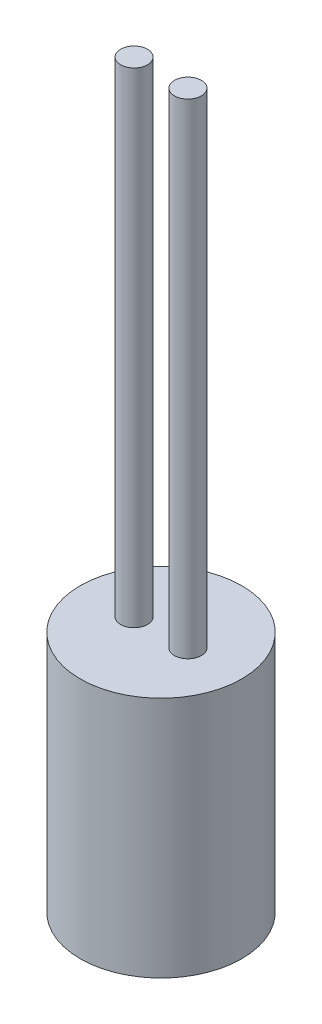
ISO-10303-21;
HEADER;
FILE_DESCRIPTION(('STEP AP214'),'2;1');
FILE_NAME('part.step','',(''),(''),'','','');
FILE_SCHEMA(('AUTOMOTIVE_DESIGN { 1 0 10303 214 1 1 1 1 }'));
ENDSEC;
DATA;
#1=APPLICATION_CONTEXT('core data for automotive mechanical design processes');
#2=APPLICATION_PROTOCOL_DEFINITION('international standard','automotive_design',2000,#1);
#3=PRODUCT_CONTEXT('',#1,'mechanical');
#4=PRODUCT('Part','Part','',(#3));
#5=PRODUCT_RELATED_PRODUCT_CATEGORY('part','',(#4));
#6=PRODUCT_DEFINITION_FORMATION('','',#4);
#7=PRODUCT_DEFINITION_CONTEXT('part definition',#1,'design');
#8=PRODUCT_DEFINITION('design','',#6,#7);
#9=PRODUCT_DEFINITION_SHAPE('','',#8);
#10=(LENGTH_UNIT() NAMED_UNIT(*) SI_UNIT(.MILLI.,.METRE.));
#11=(NAMED_UNIT(*) PLANE_ANGLE_UNIT() SI_UNIT($,.RADIAN.));
#12=(NAMED_UNIT(*) SI_UNIT($,.STERADIAN.) SOLID_ANGLE_UNIT());
#13=UNCERTAINTY_MEASURE_WITH_UNIT(LENGTH_MEASURE(1.E-05),#10,'distance_accuracy_value','');
#14=(GEOMETRIC_REPRESENTATION_CONTEXT(3) GLOBAL_UNCERTAINTY_ASSIGNED_CONTEXT((#13)) GLOBAL_UNIT_ASSIGNED_CONTEXT((#10,
#11,#12)) REPRESENTATION_CONTEXT('',''));
#15=CARTESIAN_POINT('',(0.,0.,0.));
#16=DIRECTION('',(0.,0.,1.));
#17=DIRECTION('',(1.,0.,0.));
#18=AXIS2_PLACEMENT_3D('',#15,#16,#17);
#19=CARTESIAN_POINT('',(0.,-9.,0.));
#20=DIRECTION('',(0.,1.,0.));
#21=DIRECTION('',(0.,0.,1.));
#22=AXIS2_PLACEMENT_3D('',#19,#20,#21);
#23=CYLINDRICAL_SURFACE('',#22,3.);
#24=CARTESIAN_POINT('',(0.,-9.,0.));
#25=DIRECTION('',(0.,1.,0.));
#26=DIRECTION('',(0.,0.,1.));
#27=AXIS2_PLACEMENT_3D('',#24,#25,#26);
#28=CIRCLE('',#27,3.);
#29=CARTESIAN_POINT('',(0.,-9.,3.));
#30=VERTEX_POINT('',#29);
#31=EDGE_CURVE('E10',#30,#30,#28,.T.);
#32=ORIENTED_EDGE('',*,*,#31,.T.);
#33=EDGE_LOOP('',(#32));
#34=FACE_BOUND('',#33,.T.);
#35=CARTESIAN_POINT('',(0.,0.,0.));
#36=DIRECTION('',(0.,1.,0.));
#37=DIRECTION('',(0.,0.,1.));
#38=AXIS2_PLACEMENT_3D('',#35,#36,#37);
#39=CIRCLE('',#38,3.);
#40=CARTESIAN_POINT('',(0.,0.,3.));
#41=VERTEX_POINT('',#40);
#42=EDGE_CURVE('E46',#41,#41,#39,.T.);
#43=ORIENTED_EDGE('',*,*,#42,.F.);
#44=EDGE_LOOP('',(#43));
#45=FACE_BOUND('',#44,.T.);
#46=ADVANCED_FACE('F43',(#34,#45),#23,.T.);
#47=CARTESIAN_POINT('',(0.,-9.,0.));
#48=DIRECTION('',(0.,1.,0.));
#49=DIRECTION('',(0.,0.,1.));
#50=AXIS2_PLACEMENT_3D('',#47,#48,#49);
#51=PLANE('',#50);
#52=ORIENTED_EDGE('',*,*,#31,.F.);
#53=EDGE_LOOP('',(#52));
#54=FACE_BOUND('',#53,.T.);
#55=ADVANCED_FACE('F79',(#54),#51,.F.);
#56=CARTESIAN_POINT('',(0.,0.,0.));
#57=DIRECTION('',(0.,1.,0.));
#58=DIRECTION('',(0.,0.,1.));
#59=AXIS2_PLACEMENT_3D('',#56,#57,#58);
#60=PLANE('',#59);
#61=CARTESIAN_POINT('',(0.999999999999999,0.,0.));
#62=DIRECTION('',(0.,1.,0.));
#63=DIRECTION('',(0.,0.,1.));
#64=AXIS2_PLACEMENT_3D('',#61,#62,#63);
#65=CIRCLE('',#64,0.5);
#66=CARTESIAN_POINT('',(0.999999999999999,0.,0.5));
#67=VERTEX_POINT('',#66);
#68=EDGE_CURVE('E61',#67,#67,#65,.T.);
#69=ORIENTED_EDGE('',*,*,#68,.F.);
#70=EDGE_LOOP('',(#69));
#71=FACE_BOUND('',#70,.T.);
#72=CARTESIAN_POINT('',(-0.999999999999999,0.,0.));
#73=DIRECTION('',(0.,1.,0.));
#74=DIRECTION('',(0.,0.,1.));
#75=AXIS2_PLACEMENT_3D('',#72,#73,#74);
#76=CIRCLE('',#75,0.5);
#77=CARTESIAN_POINT('',(-0.999999999999999,0.,0.5));
#78=VERTEX_POINT('',#77);
#79=EDGE_CURVE('E57',#78,#78,#76,.T.);
#80=ORIENTED_EDGE('',*,*,#79,.F.);
#81=EDGE_LOOP('',(#80));
#82=FACE_BOUND('',#81,.T.);
#83=ORIENTED_EDGE('',*,*,#42,.T.);
#84=EDGE_LOOP('',(#83));
#85=FACE_BOUND('',#84,.T.);
#86=ADVANCED_FACE('F75',(#71,#82,#85),#60,.T.);
#87=CARTESIAN_POINT('',(-0.999999999999999,18.,0.));
#88=DIRECTION('',(0.,-1.,0.));
#89=DIRECTION('',(0.,0.,-1.));
#90=AXIS2_PLACEMENT_3D('',#87,#88,#89);
#91=CYLINDRICAL_SURFACE('',#90,0.5);
#92=CARTESIAN_POINT('',(-0.999999999999999,18.,0.));
#93=DIRECTION('',(0.,1.,0.));
#94=DIRECTION('',(0.,0.,1.));
#95=AXIS2_PLACEMENT_3D('',#92,#93,#94);
#96=CIRCLE('',#95,0.5);
#97=CARTESIAN_POINT('',(-0.999999999999999,18.,0.5));
#98=VERTEX_POINT('',#97);
#99=EDGE_CURVE('E55',#98,#98,#96,.T.);
#100=ORIENTED_EDGE('',*,*,#99,.F.);
#101=EDGE_LOOP('',(#100));
#102=FACE_BOUND('',#101,.T.);
#103=ORIENTED_EDGE('',*,*,#79,.T.);
#104=EDGE_LOOP('',(#103));
#105=FACE_BOUND('',#104,.T.);
#106=ADVANCED_FACE('F78',(#102,#105),#91,.T.);
#107=CARTESIAN_POINT('',(-0.999999999999999,18.,0.));
#108=DIRECTION('',(0.,1.,0.));
#109=DIRECTION('',(0.,0.,1.));
#110=AXIS2_PLACEMENT_3D('',#107,#108,#109);
#111=PLANE('',#110);
#112=ORIENTED_EDGE('',*,*,#99,.T.);
#113=EDGE_LOOP('',(#112));
#114=FACE_BOUND('',#113,.T.);
#115=ADVANCED_FACE('F95',(#114),#111,.T.);
#116=CARTESIAN_POINT('',(0.999999999999999,18.,0.));
#117=DIRECTION('',(0.,-1.,0.));
#118=DIRECTION('',(0.,0.,-1.));
#119=AXIS2_PLACEMENT_3D('',#116,#117,#118);
#120=CYLINDRICAL_SURFACE('',#119,0.5);
#121=CARTESIAN_POINT('',(0.999999999999999,18.,0.));
#122=DIRECTION('',(0.,1.,0.));
#123=DIRECTION('',(0.,0.,1.));
#124=AXIS2_PLACEMENT_3D('',#121,#122,#123);
#125=CIRCLE('',#124,0.5);
#126=CARTESIAN_POINT('',(0.999999999999999,18.,0.5));
#127=VERTEX_POINT('',#126);
#128=EDGE_CURVE('E65',#127,#127,#125,.T.);
#129=ORIENTED_EDGE('',*,*,#128,.F.);
#130=EDGE_LOOP('',(#129));
#131=FACE_BOUND('',#130,.T.);
#132=ORIENTED_EDGE('',*,*,#68,.T.);
#133=EDGE_LOOP('',(#132));
#134=FACE_BOUND('',#133,.T.);
#135=ADVANCED_FACE('F73',(#131,#134),#120,.T.);
#136=CARTESIAN_POINT('',(0.999999999999999,18.,0.));
#137=DIRECTION('',(0.,1.,0.));
#138=DIRECTION('',(0.,0.,1.));
#139=AXIS2_PLACEMENT_3D('',#136,#137,#138);
#140=PLANE('',#139);
#141=ORIENTED_EDGE('',*,*,#128,.T.);
#142=EDGE_LOOP('',(#141));
#143=FACE_BOUND('',#142,.T.);
#144=ADVANCED_FACE('F100',(#143),#140,.T.);
#145=CLOSED_SHELL('',(#46,#55,#86,#106,#115,#135,#144));
#146=MANIFOLD_SOLID_BREP('B2',#145);
#147=ADVANCED_BREP_SHAPE_REPRESENTATION('',(#18,#146),#14);
#148=SHAPE_DEFINITION_REPRESENTATION(#9,#147);
ENDSEC;
END-ISO-10303-21;
